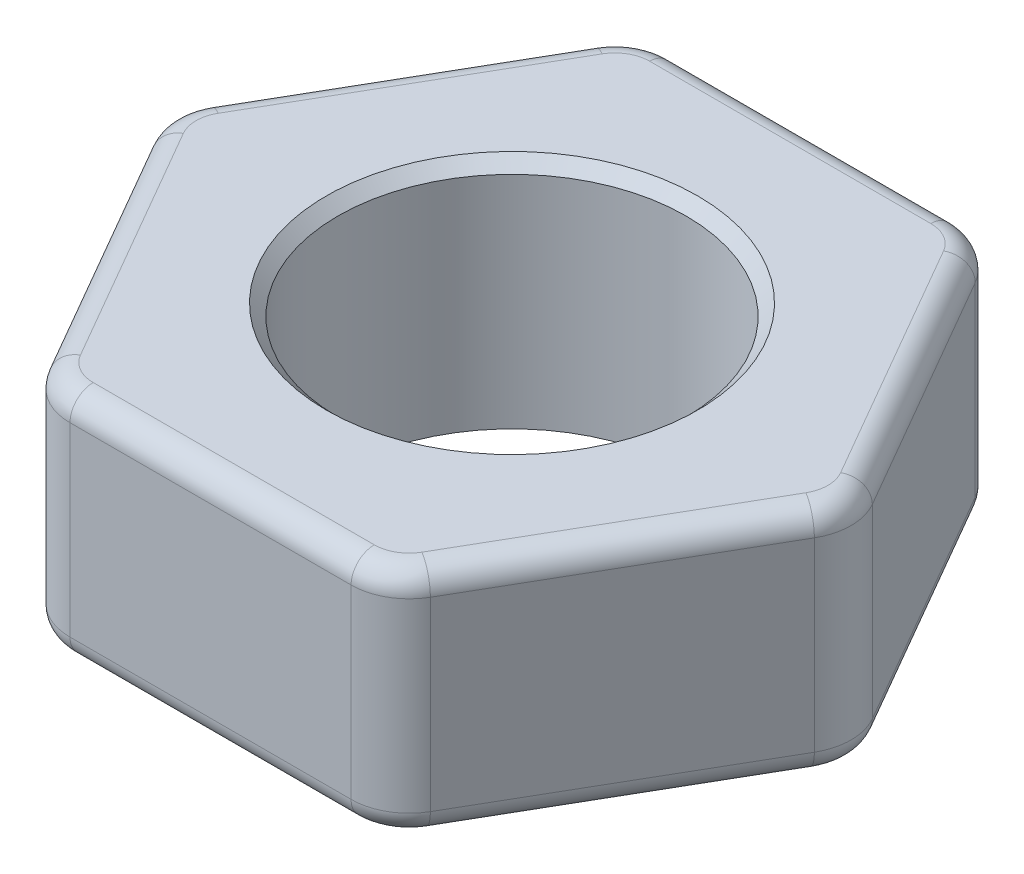
ISO-10303-21;
HEADER;
FILE_DESCRIPTION(('STEP AP214'),'2;1');
FILE_NAME('part.step','',(''),(''),'','','');
FILE_SCHEMA(('AUTOMOTIVE_DESIGN { 1 0 10303 214 1 1 1 1 }'));
ENDSEC;
DATA;
#1=APPLICATION_CONTEXT('core data for automotive mechanical design processes');
#2=APPLICATION_PROTOCOL_DEFINITION('international standard','automotive_design',2000,#1);
#3=PRODUCT_CONTEXT('',#1,'mechanical');
#4=PRODUCT('Part','Part','',(#3));
#5=PRODUCT_RELATED_PRODUCT_CATEGORY('part','',(#4));
#6=PRODUCT_DEFINITION_FORMATION('','',#4);
#7=PRODUCT_DEFINITION_CONTEXT('part definition',#1,'design');
#8=PRODUCT_DEFINITION('design','',#6,#7);
#9=PRODUCT_DEFINITION_SHAPE('','',#8);
#10=(LENGTH_UNIT() NAMED_UNIT(*) SI_UNIT(.MILLI.,.METRE.));
#11=(NAMED_UNIT(*) PLANE_ANGLE_UNIT() SI_UNIT($,.RADIAN.));
#12=(NAMED_UNIT(*) SI_UNIT($,.STERADIAN.) SOLID_ANGLE_UNIT());
#13=UNCERTAINTY_MEASURE_WITH_UNIT(LENGTH_MEASURE(1.E-05),#10,'distance_accuracy_value','');
#14=(GEOMETRIC_REPRESENTATION_CONTEXT(3) GLOBAL_UNCERTAINTY_ASSIGNED_CONTEXT((#13)) GLOBAL_UNIT_ASSIGNED_CONTEXT((#10,
#11,#12)) REPRESENTATION_CONTEXT('',''));
#15=CARTESIAN_POINT('',(0.,0.,0.));
#16=DIRECTION('',(0.,0.,1.));
#17=DIRECTION('',(1.,0.,0.));
#18=AXIS2_PLACEMENT_3D('',#15,#16,#17);
#19=CARTESIAN_POINT('',(1.5,2.,2.59807621135332));
#20=DIRECTION('',(-0.866025403784439,0.,-0.5));
#21=DIRECTION('',(-0.5,0.,0.866025403784439));
#22=AXIS2_PLACEMENT_3D('',#19,#20,#21);
#23=PLANE('',#22);
#24=DIRECTION('',(0.,-1.,0.));
#25=VECTOR('',#24,1.);
#26=CARTESIAN_POINT('',(1.64433756729741,2.,2.34807621135332));
#27=LINE('',#26,#25);
#28=CARTESIAN_POINT('',(1.64433756729741,1.8,2.34807621135332));
#29=VERTEX_POINT('',#28);
#30=CARTESIAN_POINT('',(1.64433756729741,0.2,2.34807621135332));
#31=VERTEX_POINT('',#30);
#32=EDGE_CURVE('E230',#29,#31,#27,.T.);
#33=ORIENTED_EDGE('',*,*,#32,.T.);
#34=DIRECTION('',(0.5,0.,-0.866025403784439));
#35=VECTOR('',#34,1.);
#36=CARTESIAN_POINT('',(1.5,0.2,2.59807621135332));
#37=LINE('',#36,#35);
#38=CARTESIAN_POINT('',(2.85566243270259,0.2,0.249999999999999));
#39=VERTEX_POINT('',#38);
#40=EDGE_CURVE('E285',#31,#39,#37,.T.);
#41=ORIENTED_EDGE('',*,*,#40,.T.);
#42=DIRECTION('',(0.,-1.,0.));
#43=VECTOR('',#42,1.);
#44=CARTESIAN_POINT('',(2.85566243270259,2.,0.249999999999999));
#45=LINE('',#44,#43);
#46=CARTESIAN_POINT('',(2.85566243270259,1.8,0.249999999999999));
#47=VERTEX_POINT('',#46);
#48=EDGE_CURVE('E227',#39,#47,#45,.F.);
#49=ORIENTED_EDGE('',*,*,#48,.T.);
#50=DIRECTION('',(0.5,0.,-0.866025403784439));
#51=VECTOR('',#50,1.);
#52=CARTESIAN_POINT('',(1.64433756729741,1.8,2.34807621135331));
#53=LINE('',#52,#51);
#54=EDGE_CURVE('E283',#47,#29,#53,.F.);
#55=ORIENTED_EDGE('',*,*,#54,.T.);
#56=EDGE_LOOP('',(#33,#41,#49,#55));
#57=FACE_BOUND('',#56,.T.);
#58=ADVANCED_FACE('F39',(#57),#23,.F.);
#59=CARTESIAN_POINT('',(3.,2.,0.));
#60=DIRECTION('',(-0.866025403784439,0.,0.5));
#61=DIRECTION('',(0.5,0.,0.866025403784439));
#62=AXIS2_PLACEMENT_3D('',#59,#60,#61);
#63=PLANE('',#62);
#64=DIRECTION('',(0.,-1.,0.));
#65=VECTOR('',#64,1.);
#66=CARTESIAN_POINT('',(2.85566243270259,2.,-0.25));
#67=LINE('',#66,#65);
#68=CARTESIAN_POINT('',(2.85566243270259,1.8,-0.25));
#69=VERTEX_POINT('',#68);
#70=CARTESIAN_POINT('',(2.85566243270259,0.2,-0.25));
#71=VERTEX_POINT('',#70);
#72=EDGE_CURVE('E565',#69,#71,#67,.T.);
#73=ORIENTED_EDGE('',*,*,#72,.T.);
#74=DIRECTION('',(-0.5,0.,-0.866025403784439));
#75=VECTOR('',#74,1.);
#76=CARTESIAN_POINT('',(3.,0.2,0.));
#77=LINE('',#76,#75);
#78=CARTESIAN_POINT('',(1.6443375672974,0.2,-2.34807621135332));
#79=VERTEX_POINT('',#78);
#80=EDGE_CURVE('E277',#71,#79,#77,.T.);
#81=ORIENTED_EDGE('',*,*,#80,.T.);
#82=DIRECTION('',(0.,-1.,0.));
#83=VECTOR('',#82,1.);
#84=CARTESIAN_POINT('',(1.6443375672974,2.,-2.34807621135332));
#85=LINE('',#84,#83);
#86=CARTESIAN_POINT('',(1.6443375672974,1.8,-2.34807621135332));
#87=VERTEX_POINT('',#86);
#88=EDGE_CURVE('E568',#79,#87,#85,.F.);
#89=ORIENTED_EDGE('',*,*,#88,.T.);
#90=DIRECTION('',(-0.5,0.,-0.866025403784439));
#91=VECTOR('',#90,1.);
#92=CARTESIAN_POINT('',(2.85566243270259,1.8,-0.25));
#93=LINE('',#92,#91);
#94=EDGE_CURVE('E275',#87,#69,#93,.F.);
#95=ORIENTED_EDGE('',*,*,#94,.T.);
#96=EDGE_LOOP('',(#73,#81,#89,#95));
#97=FACE_BOUND('',#96,.T.);
#98=ADVANCED_FACE('F402',(#97),#63,.F.);
#99=CARTESIAN_POINT('',(1.5,2.,-2.59807621135332));
#100=DIRECTION('',(0.,0.,1.));
#101=DIRECTION('',(1.,0.,0.));
#102=AXIS2_PLACEMENT_3D('',#99,#100,#101);
#103=PLANE('',#102);
#104=DIRECTION('',(0.,-1.,0.));
#105=VECTOR('',#104,1.);
#106=CARTESIAN_POINT('',(1.21132486540519,2.,-2.59807621135332));
#107=LINE('',#106,#105);
#108=CARTESIAN_POINT('',(1.21132486540519,1.8,-2.59807621135332));
#109=VERTEX_POINT('',#108);
#110=CARTESIAN_POINT('',(1.21132486540519,0.2,-2.59807621135332));
#111=VERTEX_POINT('',#110);
#112=EDGE_CURVE('E559',#109,#111,#107,.T.);
#113=ORIENTED_EDGE('',*,*,#112,.T.);
#114=DIRECTION('',(-1.,0.,0.));
#115=VECTOR('',#114,1.);
#116=CARTESIAN_POINT('',(1.5,0.2,-2.59807621135332));
#117=LINE('',#116,#115);
#118=CARTESIAN_POINT('',(-1.21132486540519,0.2,-2.59807621135332));
#119=VERTEX_POINT('',#118);
#120=EDGE_CURVE('E269',#111,#119,#117,.T.);
#121=ORIENTED_EDGE('',*,*,#120,.T.);
#122=DIRECTION('',(0.,-1.,0.));
#123=VECTOR('',#122,1.);
#124=CARTESIAN_POINT('',(-1.21132486540519,2.,-2.59807621135332));
#125=LINE('',#124,#123);
#126=CARTESIAN_POINT('',(-1.21132486540519,1.8,-2.59807621135332));
#127=VERTEX_POINT('',#126);
#128=EDGE_CURVE('E562',#119,#127,#125,.F.);
#129=ORIENTED_EDGE('',*,*,#128,.T.);
#130=DIRECTION('',(-1.,0.,0.));
#131=VECTOR('',#130,1.);
#132=CARTESIAN_POINT('',(1.21132486540519,1.8,-2.59807621135332));
#133=LINE('',#132,#131);
#134=EDGE_CURVE('E267',#127,#109,#133,.F.);
#135=ORIENTED_EDGE('',*,*,#134,.T.);
#136=EDGE_LOOP('',(#113,#121,#129,#135));
#137=FACE_BOUND('',#136,.T.);
#138=ADVANCED_FACE('F408',(#137),#103,.F.);
#139=CARTESIAN_POINT('',(-1.5,2.,-2.59807621135332));
#140=DIRECTION('',(0.866025403784439,0.,0.5));
#141=DIRECTION('',(0.5,0.,-0.866025403784439));
#142=AXIS2_PLACEMENT_3D('',#139,#140,#141);
#143=PLANE('',#142);
#144=DIRECTION('',(0.,-1.,0.));
#145=VECTOR('',#144,1.);
#146=CARTESIAN_POINT('',(-1.64433756729741,2.,-2.34807621135332));
#147=LINE('',#146,#145);
#148=CARTESIAN_POINT('',(-1.64433756729741,1.8,-2.34807621135332));
#149=VERTEX_POINT('',#148);
#150=CARTESIAN_POINT('',(-1.64433756729741,0.2,-2.34807621135332));
#151=VERTEX_POINT('',#150);
#152=EDGE_CURVE('E553',#149,#151,#147,.T.);
#153=ORIENTED_EDGE('',*,*,#152,.T.);
#154=DIRECTION('',(-0.5,0.,0.866025403784439));
#155=VECTOR('',#154,1.);
#156=CARTESIAN_POINT('',(-1.5,0.2,-2.59807621135332));
#157=LINE('',#156,#155);
#158=CARTESIAN_POINT('',(-2.85566243270259,0.2,-0.25));
#159=VERTEX_POINT('',#158);
#160=EDGE_CURVE('E260',#151,#159,#157,.T.);
#161=ORIENTED_EDGE('',*,*,#160,.T.);
#162=DIRECTION('',(0.,-1.,0.));
#163=VECTOR('',#162,1.);
#164=CARTESIAN_POINT('',(-2.85566243270259,2.,-0.25));
#165=LINE('',#164,#163);
#166=CARTESIAN_POINT('',(-2.85566243270259,1.8,-0.25));
#167=VERTEX_POINT('',#166);
#168=EDGE_CURVE('E556',#159,#167,#165,.F.);
#169=ORIENTED_EDGE('',*,*,#168,.T.);
#170=DIRECTION('',(-0.5,0.,0.866025403784439));
#171=VECTOR('',#170,1.);
#172=CARTESIAN_POINT('',(-1.64433756729741,1.8,-2.34807621135332));
#173=LINE('',#172,#171);
#174=EDGE_CURVE('E258',#167,#149,#173,.F.);
#175=ORIENTED_EDGE('',*,*,#174,.T.);
#176=EDGE_LOOP('',(#153,#161,#169,#175));
#177=FACE_BOUND('',#176,.T.);
#178=ADVANCED_FACE('F607',(#177),#143,.F.);
#179=CARTESIAN_POINT('',(-3.,2.,0.));
#180=DIRECTION('',(0.866025403784439,0.,-0.5));
#181=DIRECTION('',(-0.5,0.,-0.866025403784439));
#182=AXIS2_PLACEMENT_3D('',#179,#180,#181);
#183=PLANE('',#182);
#184=DIRECTION('',(0.,-1.,0.));
#185=VECTOR('',#184,1.);
#186=CARTESIAN_POINT('',(-1.64433756729741,2.,2.34807621135331));
#187=LINE('',#186,#185);
#188=CARTESIAN_POINT('',(-1.64433756729741,0.2,2.34807621135331));
#189=VERTEX_POINT('',#188);
#190=CARTESIAN_POINT('',(-1.64433756729741,1.8,2.34807621135331));
#191=VERTEX_POINT('',#190);
#192=EDGE_CURVE('E547',#189,#191,#187,.F.);
#193=ORIENTED_EDGE('',*,*,#192,.T.);
#194=DIRECTION('',(0.5,0.,0.866025403784439));
#195=VECTOR('',#194,1.);
#196=CARTESIAN_POINT('',(-2.85566243270259,1.8,0.249999999999999));
#197=LINE('',#196,#195);
#198=CARTESIAN_POINT('',(-2.85566243270259,1.8,0.249999999999999));
#199=VERTEX_POINT('',#198);
#200=EDGE_CURVE('E322',#191,#199,#197,.F.);
#201=ORIENTED_EDGE('',*,*,#200,.T.);
#202=DIRECTION('',(0.,-1.,0.));
#203=VECTOR('',#202,1.);
#204=CARTESIAN_POINT('',(-2.85566243270259,2.,0.249999999999999));
#205=LINE('',#204,#203);
#206=CARTESIAN_POINT('',(-2.85566243270259,0.2,0.249999999999999));
#207=VERTEX_POINT('',#206);
#208=EDGE_CURVE('E544',#199,#207,#205,.T.);
#209=ORIENTED_EDGE('',*,*,#208,.T.);
#210=DIRECTION('',(0.5,0.,0.866025403784439));
#211=VECTOR('',#210,1.);
#212=CARTESIAN_POINT('',(-3.,0.2,0.));
#213=LINE('',#212,#211);
#214=EDGE_CURVE('E320',#207,#189,#213,.T.);
#215=ORIENTED_EDGE('',*,*,#214,.T.);
#216=EDGE_LOOP('',(#193,#201,#209,#215));
#217=FACE_BOUND('',#216,.T.);
#218=ADVANCED_FACE('F620',(#217),#183,.F.);
#219=CARTESIAN_POINT('',(-1.5,2.,2.59807621135331));
#220=DIRECTION('',(0.,0.,-1.));
#221=DIRECTION('',(-1.,0.,0.));
#222=AXIS2_PLACEMENT_3D('',#219,#220,#221);
#223=PLANE('',#222);
#224=DIRECTION('',(0.,-1.,0.));
#225=VECTOR('',#224,1.);
#226=CARTESIAN_POINT('',(-1.21132486540519,2.,2.59807621135331));
#227=LINE('',#226,#225);
#228=CARTESIAN_POINT('',(-1.21132486540519,1.8,2.59807621135331));
#229=VERTEX_POINT('',#228);
#230=CARTESIAN_POINT('',(-1.21132486540519,0.2,2.59807621135331));
#231=VERTEX_POINT('',#230);
#232=EDGE_CURVE('E538',#229,#231,#227,.T.);
#233=ORIENTED_EDGE('',*,*,#232,.T.);
#234=DIRECTION('',(1.,0.,0.));
#235=VECTOR('',#234,1.);
#236=CARTESIAN_POINT('',(-1.5,0.2,2.59807621135331));
#237=LINE('',#236,#235);
#238=CARTESIAN_POINT('',(1.21132486540519,0.2,2.59807621135332));
#239=VERTEX_POINT('',#238);
#240=EDGE_CURVE('E293',#231,#239,#237,.T.);
#241=ORIENTED_EDGE('',*,*,#240,.T.);
#242=DIRECTION('',(0.,-1.,0.));
#243=VECTOR('',#242,1.);
#244=CARTESIAN_POINT('',(1.21132486540519,2.,2.59807621135332));
#245=LINE('',#244,#243);
#246=CARTESIAN_POINT('',(1.21132486540519,1.8,2.59807621135332));
#247=VERTEX_POINT('',#246);
#248=EDGE_CURVE('E541',#239,#247,#245,.F.);
#249=ORIENTED_EDGE('',*,*,#248,.T.);
#250=DIRECTION('',(1.,0.,0.));
#251=VECTOR('',#250,1.);
#252=CARTESIAN_POINT('',(-1.21132486540519,1.8,2.59807621135331));
#253=LINE('',#252,#251);
#254=EDGE_CURVE('E291',#247,#229,#253,.F.);
#255=ORIENTED_EDGE('',*,*,#254,.T.);
#256=EDGE_LOOP('',(#233,#241,#249,#255));
#257=FACE_BOUND('',#256,.T.);
#258=ADVANCED_FACE('F537',(#257),#223,.F.);
#259=CARTESIAN_POINT('',(0.,2.,0.));
#260=DIRECTION('',(0.,1.,0.));
#261=DIRECTION('',(0.,0.,1.));
#262=AXIS2_PLACEMENT_3D('',#259,#260,#261);
#263=PLANE('',#262);
#264=CARTESIAN_POINT('',(0.,2.,0.));
#265=DIRECTION('',(0.,1.,0.));
#266=DIRECTION('',(0.,0.,1.));
#267=AXIS2_PLACEMENT_3D('',#264,#265,#266);
#268=CIRCLE('',#267,1.6);
#269=CARTESIAN_POINT('',(0.,2.,1.6));
#270=VERTEX_POINT('',#269);
#271=EDGE_CURVE('E11',#270,#270,#268,.F.);
#272=ORIENTED_EDGE('',*,*,#271,.T.);
#273=EDGE_LOOP('',(#272));
#274=FACE_BOUND('',#273,.T.);
#275=DIRECTION('',(-1.,0.,0.));
#276=VECTOR('',#275,1.);
#277=CARTESIAN_POINT('',(-1.21132486540519,2.,-2.39807621135332));
#278=LINE('',#277,#276);
#279=CARTESIAN_POINT('',(1.21132486540519,2.,-2.39807621135332));
#280=VERTEX_POINT('',#279);
#281=CARTESIAN_POINT('',(-1.21132486540519,2.,-2.39807621135332));
#282=VERTEX_POINT('',#281);
#283=EDGE_CURVE('E55',#280,#282,#278,.T.);
#284=ORIENTED_EDGE('',*,*,#283,.T.);
#285=CARTESIAN_POINT('',(-1.21132486540519,2.,-2.09807621135332));
#286=DIRECTION('',(0.,1.,0.));
#287=DIRECTION('',(0.,0.,1.));
#288=AXIS2_PLACEMENT_3D('',#285,#286,#287);
#289=CIRCLE('',#288,0.3);
#290=CARTESIAN_POINT('',(-1.47113248654052,2.,-2.24807621135332));
#291=VERTEX_POINT('',#290);
#292=EDGE_CURVE('E318',#282,#291,#289,.T.);
#293=ORIENTED_EDGE('',*,*,#292,.T.);
#294=DIRECTION('',(-0.5,0.,0.866025403784439));
#295=VECTOR('',#294,1.);
#296=CARTESIAN_POINT('',(-2.68245735194571,2.,-0.15));
#297=LINE('',#296,#295);
#298=CARTESIAN_POINT('',(-2.68245735194571,2.,-0.15));
#299=VERTEX_POINT('',#298);
#300=EDGE_CURVE('E298',#291,#299,#297,.T.);
#301=ORIENTED_EDGE('',*,*,#300,.T.);
#302=CARTESIAN_POINT('',(-2.42264973081037,2.,0.));
#303=DIRECTION('',(0.,1.,0.));
#304=DIRECTION('',(0.,0.,1.));
#305=AXIS2_PLACEMENT_3D('',#302,#303,#304);
#306=CIRCLE('',#305,0.3);
#307=CARTESIAN_POINT('',(-2.68245735194571,2.,0.149999999999999));
#308=VERTEX_POINT('',#307);
#309=EDGE_CURVE('E300',#299,#308,#306,.T.);
#310=ORIENTED_EDGE('',*,*,#309,.T.);
#311=DIRECTION('',(0.5,0.,0.866025403784439));
#312=VECTOR('',#311,1.);
#313=CARTESIAN_POINT('',(-1.47113248654052,2.,2.24807621135332));
#314=LINE('',#313,#312);
#315=CARTESIAN_POINT('',(-1.47113248654052,2.,2.24807621135331));
#316=VERTEX_POINT('',#315);
#317=EDGE_CURVE('E302',#308,#316,#314,.T.);
#318=ORIENTED_EDGE('',*,*,#317,.T.);
#319=CARTESIAN_POINT('',(-1.21132486540519,2.,2.09807621135331));
#320=DIRECTION('',(0.,1.,0.));
#321=DIRECTION('',(0.,0.,1.));
#322=AXIS2_PLACEMENT_3D('',#319,#320,#321);
#323=CIRCLE('',#322,0.3);
#324=CARTESIAN_POINT('',(-1.21132486540519,2.,2.39807621135331));
#325=VERTEX_POINT('',#324);
#326=EDGE_CURVE('E304',#316,#325,#323,.T.);
#327=ORIENTED_EDGE('',*,*,#326,.T.);
#328=DIRECTION('',(1.,0.,0.));
#329=VECTOR('',#328,1.);
#330=CARTESIAN_POINT('',(1.21132486540519,2.,2.39807621135332));
#331=LINE('',#330,#329);
#332=CARTESIAN_POINT('',(1.21132486540519,2.,2.39807621135332));
#333=VERTEX_POINT('',#332);
#334=EDGE_CURVE('E306',#325,#333,#331,.T.);
#335=ORIENTED_EDGE('',*,*,#334,.T.);
#336=CARTESIAN_POINT('',(1.21132486540519,2.,2.09807621135332));
#337=DIRECTION('',(0.,1.,0.));
#338=DIRECTION('',(0.,0.,1.));
#339=AXIS2_PLACEMENT_3D('',#336,#337,#338);
#340=CIRCLE('',#339,0.3);
#341=CARTESIAN_POINT('',(1.47113248654052,2.,2.24807621135332));
#342=VERTEX_POINT('',#341);
#343=EDGE_CURVE('E308',#333,#342,#340,.T.);
#344=ORIENTED_EDGE('',*,*,#343,.T.);
#345=DIRECTION('',(0.5,0.,-0.866025403784439));
#346=VECTOR('',#345,1.);
#347=CARTESIAN_POINT('',(2.6824573519457,2.,0.149999999999999));
#348=LINE('',#347,#346);
#349=CARTESIAN_POINT('',(2.6824573519457,2.,0.149999999999999));
#350=VERTEX_POINT('',#349);
#351=EDGE_CURVE('E310',#342,#350,#348,.T.);
#352=ORIENTED_EDGE('',*,*,#351,.T.);
#353=CARTESIAN_POINT('',(2.42264973081037,2.,0.));
#354=DIRECTION('',(0.,1.,0.));
#355=DIRECTION('',(0.,0.,1.));
#356=AXIS2_PLACEMENT_3D('',#353,#354,#355);
#357=CIRCLE('',#356,0.3);
#358=CARTESIAN_POINT('',(2.6824573519457,2.,-0.15));
#359=VERTEX_POINT('',#358);
#360=EDGE_CURVE('E312',#350,#359,#357,.T.);
#361=ORIENTED_EDGE('',*,*,#360,.T.);
#362=DIRECTION('',(-0.5,0.,-0.866025403784439));
#363=VECTOR('',#362,1.);
#364=CARTESIAN_POINT('',(1.47113248654052,2.,-2.24807621135332));
#365=LINE('',#364,#363);
#366=CARTESIAN_POINT('',(1.47113248654052,2.,-2.24807621135332));
#367=VERTEX_POINT('',#366);
#368=EDGE_CURVE('E314',#359,#367,#365,.T.);
#369=ORIENTED_EDGE('',*,*,#368,.T.);
#370=CARTESIAN_POINT('',(1.21132486540519,2.,-2.09807621135332));
#371=DIRECTION('',(0.,1.,0.));
#372=DIRECTION('',(0.,0.,1.));
#373=AXIS2_PLACEMENT_3D('',#370,#371,#372);
#374=CIRCLE('',#373,0.3);
#375=EDGE_CURVE('E60',#367,#280,#374,.T.);
#376=ORIENTED_EDGE('',*,*,#375,.T.);
#377=EDGE_LOOP('',(#284,#293,#301,#310,#318,#327,#335,#344,#352,#361,#369,#376));
#378=FACE_BOUND('',#377,.T.);
#379=ADVANCED_FACE('F598',(#274,#378),#263,.T.);
#380=CARTESIAN_POINT('',(0.,0.,0.));
#381=DIRECTION('',(0.,1.,0.));
#382=DIRECTION('',(0.,0.,1.));
#383=AXIS2_PLACEMENT_3D('',#380,#381,#382);
#384=PLANE('',#383);
#385=DIRECTION('',(0.5,0.,0.866025403784439));
#386=VECTOR('',#385,1.);
#387=CARTESIAN_POINT('',(-2.07679491924311,0.,1.19903810567666));
#388=LINE('',#387,#386);
#389=CARTESIAN_POINT('',(-1.47113248654052,0.,2.24807621135331));
#390=VERTEX_POINT('',#389);
#391=CARTESIAN_POINT('',(-2.68245735194571,0.,0.149999999999999));
#392=VERTEX_POINT('',#391);
#393=EDGE_CURVE('E206',#390,#392,#388,.F.);
#394=ORIENTED_EDGE('',*,*,#393,.T.);
#395=CARTESIAN_POINT('',(-2.42264973081037,0.,0.));
#396=DIRECTION('',(0.,1.,0.));
#397=DIRECTION('',(0.,0.,1.));
#398=AXIS2_PLACEMENT_3D('',#395,#396,#397);
#399=CIRCLE('',#398,0.3);
#400=CARTESIAN_POINT('',(-2.68245735194571,0.,-0.15));
#401=VERTEX_POINT('',#400);
#402=EDGE_CURVE('E251',#392,#401,#399,.F.);
#403=ORIENTED_EDGE('',*,*,#402,.T.);
#404=DIRECTION('',(-0.5,0.,0.866025403784439));
#405=VECTOR('',#404,1.);
#406=CARTESIAN_POINT('',(-2.07679491924311,0.,-1.19903810567666));
#407=LINE('',#406,#405);
#408=CARTESIAN_POINT('',(-1.47113248654052,0.,-2.24807621135332));
#409=VERTEX_POINT('',#408);
#410=EDGE_CURVE('E249',#401,#409,#407,.F.);
#411=ORIENTED_EDGE('',*,*,#410,.T.);
#412=CARTESIAN_POINT('',(-1.21132486540519,0.,-2.09807621135332));
#413=DIRECTION('',(0.,1.,0.));
#414=DIRECTION('',(0.,0.,1.));
#415=AXIS2_PLACEMENT_3D('',#412,#413,#414);
#416=CIRCLE('',#415,0.3);
#417=CARTESIAN_POINT('',(-1.21132486540519,0.,-2.39807621135332));
#418=VERTEX_POINT('',#417);
#419=EDGE_CURVE('E247',#409,#418,#416,.F.);
#420=ORIENTED_EDGE('',*,*,#419,.T.);
#421=DIRECTION('',(-1.,0.,0.));
#422=VECTOR('',#421,1.);
#423=CARTESIAN_POINT('',(0.,0.,-2.39807621135332));
#424=LINE('',#423,#422);
#425=CARTESIAN_POINT('',(1.21132486540519,0.,-2.39807621135332));
#426=VERTEX_POINT('',#425);
#427=EDGE_CURVE('E245',#418,#426,#424,.F.);
#428=ORIENTED_EDGE('',*,*,#427,.T.);
#429=CARTESIAN_POINT('',(1.21132486540519,0.,-2.09807621135332));
#430=DIRECTION('',(0.,1.,0.));
#431=DIRECTION('',(0.,0.,1.));
#432=AXIS2_PLACEMENT_3D('',#429,#430,#431);
#433=CIRCLE('',#432,0.3);
#434=CARTESIAN_POINT('',(1.47113248654052,0.,-2.24807621135332));
#435=VERTEX_POINT('',#434);
#436=EDGE_CURVE('E243',#426,#435,#433,.F.);
#437=ORIENTED_EDGE('',*,*,#436,.T.);
#438=DIRECTION('',(-0.5,0.,-0.866025403784439));
#439=VECTOR('',#438,1.);
#440=CARTESIAN_POINT('',(2.07679491924311,0.,-1.19903810567666));
#441=LINE('',#440,#439);
#442=CARTESIAN_POINT('',(2.6824573519457,0.,-0.15));
#443=VERTEX_POINT('',#442);
#444=EDGE_CURVE('E241',#435,#443,#441,.F.);
#445=ORIENTED_EDGE('',*,*,#444,.T.);
#446=CARTESIAN_POINT('',(2.42264973081037,0.,0.));
#447=DIRECTION('',(0.,1.,0.));
#448=DIRECTION('',(0.,0.,1.));
#449=AXIS2_PLACEMENT_3D('',#446,#447,#448);
#450=CIRCLE('',#449,0.3);
#451=CARTESIAN_POINT('',(2.6824573519457,0.,0.149999999999999));
#452=VERTEX_POINT('',#451);
#453=EDGE_CURVE('E239',#443,#452,#450,.F.);
#454=ORIENTED_EDGE('',*,*,#453,.T.);
#455=DIRECTION('',(0.5,0.,-0.866025403784439));
#456=VECTOR('',#455,1.);
#457=CARTESIAN_POINT('',(2.07679491924311,0.,1.19903810567666));
#458=LINE('',#457,#456);
#459=CARTESIAN_POINT('',(1.47113248654052,0.,2.24807621135332));
#460=VERTEX_POINT('',#459);
#461=EDGE_CURVE('E237',#452,#460,#458,.F.);
#462=ORIENTED_EDGE('',*,*,#461,.T.);
#463=CARTESIAN_POINT('',(1.21132486540519,0.,2.09807621135332));
#464=DIRECTION('',(0.,1.,0.));
#465=DIRECTION('',(0.,0.,1.));
#466=AXIS2_PLACEMENT_3D('',#463,#464,#465);
#467=CIRCLE('',#466,0.3);
#468=CARTESIAN_POINT('',(1.21132486540519,0.,2.39807621135332));
#469=VERTEX_POINT('',#468);
#470=EDGE_CURVE('E235',#460,#469,#467,.F.);
#471=ORIENTED_EDGE('',*,*,#470,.T.);
#472=DIRECTION('',(1.,0.,0.));
#473=VECTOR('',#472,1.);
#474=CARTESIAN_POINT('',(0.,0.,2.39807621135331));
#475=LINE('',#474,#473);
#476=CARTESIAN_POINT('',(-1.21132486540519,0.,2.39807621135331));
#477=VERTEX_POINT('',#476);
#478=EDGE_CURVE('E209',#469,#477,#475,.F.);
#479=ORIENTED_EDGE('',*,*,#478,.T.);
#480=CARTESIAN_POINT('',(-1.21132486540519,0.,2.09807621135331));
#481=DIRECTION('',(0.,1.,0.));
#482=DIRECTION('',(0.,0.,1.));
#483=AXIS2_PLACEMENT_3D('',#480,#481,#482);
#484=CIRCLE('',#483,0.3);
#485=EDGE_CURVE('E200',#477,#390,#484,.F.);
#486=ORIENTED_EDGE('',*,*,#485,.T.);
#487=EDGE_LOOP('',(#394,#403,#411,#420,#428,#437,#445,#454,#462,#471,#479,#486));
#488=FACE_BOUND('',#487,.T.);
#489=CARTESIAN_POINT('',(0.,0.,0.));
#490=DIRECTION('',(0.,1.,0.));
#491=DIRECTION('',(0.,0.,1.));
#492=AXIS2_PLACEMENT_3D('',#489,#490,#491);
#493=CIRCLE('',#492,1.5);
#494=CARTESIAN_POINT('',(0.,0.,1.5));
#495=VERTEX_POINT('',#494);
#496=EDGE_CURVE('E352',#495,#495,#493,.T.);
#497=ORIENTED_EDGE('',*,*,#496,.T.);
#498=EDGE_LOOP('',(#497));
#499=FACE_BOUND('',#498,.T.);
#500=ADVANCED_FACE('F202',(#488,#499),#384,.F.);
#501=CARTESIAN_POINT('',(0.,0.,0.));
#502=DIRECTION('',(0.,1.,0.));
#503=DIRECTION('',(0.,0.,1.));
#504=AXIS2_PLACEMENT_3D('',#501,#502,#503);
#505=CYLINDRICAL_SURFACE('',#504,1.5);
#506=CARTESIAN_POINT('',(0.,1.9,0.));
#507=DIRECTION('',(0.,1.,0.));
#508=DIRECTION('',(0.,0.,1.));
#509=AXIS2_PLACEMENT_3D('',#506,#507,#508);
#510=CIRCLE('',#509,1.5);
#511=CARTESIAN_POINT('',(0.,1.9,1.5));
#512=VERTEX_POINT('',#511);
#513=EDGE_CURVE('E48',#512,#512,#510,.T.);
#514=ORIENTED_EDGE('',*,*,#513,.T.);
#515=EDGE_LOOP('',(#514));
#516=FACE_BOUND('',#515,.T.);
#517=ORIENTED_EDGE('',*,*,#496,.F.);
#518=EDGE_LOOP('',(#517));
#519=FACE_BOUND('',#518,.T.);
#520=ADVANCED_FACE('F388',(#516,#519),#505,.F.);
#521=CARTESIAN_POINT('',(-1.21132486540519,2.,2.09807621135331));
#522=DIRECTION('',(0.,-1.,0.));
#523=DIRECTION('',(0.,0.,-1.));
#524=AXIS2_PLACEMENT_3D('',#521,#522,#523);
#525=CYLINDRICAL_SURFACE('',#524,0.5);
#526=ORIENTED_EDGE('',*,*,#192,.F.);
#527=CARTESIAN_POINT('',(-1.21132486540519,0.2,2.09807621135331));
#528=DIRECTION('',(0.,1.,0.));
#529=DIRECTION('',(0.,0.,1.));
#530=AXIS2_PLACEMENT_3D('',#527,#528,#529);
#531=CIRCLE('',#530,0.5);
#532=EDGE_CURVE('E218',#189,#231,#531,.T.);
#533=ORIENTED_EDGE('',*,*,#532,.T.);
#534=ORIENTED_EDGE('',*,*,#232,.F.);
#535=CARTESIAN_POINT('',(-1.21132486540519,1.8,2.09807621135331));
#536=DIRECTION('',(0.,1.,0.));
#537=DIRECTION('',(0.,0.,1.));
#538=AXIS2_PLACEMENT_3D('',#535,#536,#537);
#539=CIRCLE('',#538,0.5);
#540=EDGE_CURVE('E295',#229,#191,#539,.F.);
#541=ORIENTED_EDGE('',*,*,#540,.T.);
#542=EDGE_LOOP('',(#526,#533,#534,#541));
#543=FACE_BOUND('',#542,.T.);
#544=ADVANCED_FACE('F414',(#543),#525,.T.);
#545=CARTESIAN_POINT('',(-2.42264973081037,2.,0.));
#546=DIRECTION('',(0.,-1.,0.));
#547=DIRECTION('',(0.,0.,-1.));
#548=AXIS2_PLACEMENT_3D('',#545,#546,#547);
#549=CYLINDRICAL_SURFACE('',#548,0.5);
#550=ORIENTED_EDGE('',*,*,#168,.F.);
#551=CARTESIAN_POINT('',(-2.42264973081037,0.2,0.));
#552=DIRECTION('',(0.,1.,0.));
#553=DIRECTION('',(0.,0.,1.));
#554=AXIS2_PLACEMENT_3D('',#551,#552,#553);
#555=CIRCLE('',#554,0.5);
#556=EDGE_CURVE('E255',#159,#207,#555,.T.);
#557=ORIENTED_EDGE('',*,*,#556,.T.);
#558=ORIENTED_EDGE('',*,*,#208,.F.);
#559=CARTESIAN_POINT('',(-2.42264973081037,1.8,0.));
#560=DIRECTION('',(0.,1.,0.));
#561=DIRECTION('',(0.,0.,1.));
#562=AXIS2_PLACEMENT_3D('',#559,#560,#561);
#563=CIRCLE('',#562,0.5);
#564=EDGE_CURVE('E253',#199,#167,#563,.F.);
#565=ORIENTED_EDGE('',*,*,#564,.T.);
#566=EDGE_LOOP('',(#550,#557,#558,#565));
#567=FACE_BOUND('',#566,.T.);
#568=ADVANCED_FACE('F417',(#567),#549,.T.);
#569=CARTESIAN_POINT('',(-1.21132486540519,2.,-2.09807621135332));
#570=DIRECTION('',(0.,-1.,0.));
#571=DIRECTION('',(0.,0.,-1.));
#572=AXIS2_PLACEMENT_3D('',#569,#570,#571);
#573=CYLINDRICAL_SURFACE('',#572,0.5);
#574=ORIENTED_EDGE('',*,*,#128,.F.);
#575=CARTESIAN_POINT('',(-1.21132486540519,0.2,-2.09807621135332));
#576=DIRECTION('',(0.,1.,0.));
#577=DIRECTION('',(0.,0.,1.));
#578=AXIS2_PLACEMENT_3D('',#575,#576,#577);
#579=CIRCLE('',#578,0.5);
#580=EDGE_CURVE('E265',#119,#151,#579,.T.);
#581=ORIENTED_EDGE('',*,*,#580,.T.);
#582=ORIENTED_EDGE('',*,*,#152,.F.);
#583=CARTESIAN_POINT('',(-1.21132486540519,1.8,-2.09807621135332));
#584=DIRECTION('',(0.,1.,0.));
#585=DIRECTION('',(0.,0.,1.));
#586=AXIS2_PLACEMENT_3D('',#583,#584,#585);
#587=CIRCLE('',#586,0.5);
#588=EDGE_CURVE('E262',#149,#127,#587,.F.);
#589=ORIENTED_EDGE('',*,*,#588,.T.);
#590=EDGE_LOOP('',(#574,#581,#582,#589));
#591=FACE_BOUND('',#590,.T.);
#592=ADVANCED_FACE('F421',(#591),#573,.T.);
#593=CARTESIAN_POINT('',(1.21132486540519,2.,-2.09807621135332));
#594=DIRECTION('',(0.,-1.,0.));
#595=DIRECTION('',(0.,0.,-1.));
#596=AXIS2_PLACEMENT_3D('',#593,#594,#595);
#597=CYLINDRICAL_SURFACE('',#596,0.5);
#598=ORIENTED_EDGE('',*,*,#88,.F.);
#599=CARTESIAN_POINT('',(1.21132486540519,0.2,-2.09807621135332));
#600=DIRECTION('',(0.,1.,0.));
#601=DIRECTION('',(0.,0.,1.));
#602=AXIS2_PLACEMENT_3D('',#599,#600,#601);
#603=CIRCLE('',#602,0.5);
#604=EDGE_CURVE('E273',#79,#111,#603,.T.);
#605=ORIENTED_EDGE('',*,*,#604,.T.);
#606=ORIENTED_EDGE('',*,*,#112,.F.);
#607=CARTESIAN_POINT('',(1.21132486540519,1.8,-2.09807621135332));
#608=DIRECTION('',(0.,1.,0.));
#609=DIRECTION('',(0.,0.,1.));
#610=AXIS2_PLACEMENT_3D('',#607,#608,#609);
#611=CIRCLE('',#610,0.5);
#612=EDGE_CURVE('E271',#109,#87,#611,.F.);
#613=ORIENTED_EDGE('',*,*,#612,.T.);
#614=EDGE_LOOP('',(#598,#605,#606,#613));
#615=FACE_BOUND('',#614,.T.);
#616=ADVANCED_FACE('F425',(#615),#597,.T.);
#617=CARTESIAN_POINT('',(2.42264973081037,2.,0.));
#618=DIRECTION('',(0.,-1.,0.));
#619=DIRECTION('',(0.,0.,-1.));
#620=AXIS2_PLACEMENT_3D('',#617,#618,#619);
#621=CYLINDRICAL_SURFACE('',#620,0.5);
#622=ORIENTED_EDGE('',*,*,#48,.F.);
#623=CARTESIAN_POINT('',(2.42264973081037,0.2,0.));
#624=DIRECTION('',(0.,1.,0.));
#625=DIRECTION('',(0.,0.,1.));
#626=AXIS2_PLACEMENT_3D('',#623,#624,#625);
#627=CIRCLE('',#626,0.5);
#628=EDGE_CURVE('E281',#39,#71,#627,.T.);
#629=ORIENTED_EDGE('',*,*,#628,.T.);
#630=ORIENTED_EDGE('',*,*,#72,.F.);
#631=CARTESIAN_POINT('',(2.42264973081037,1.8,0.));
#632=DIRECTION('',(0.,1.,0.));
#633=DIRECTION('',(0.,0.,1.));
#634=AXIS2_PLACEMENT_3D('',#631,#632,#633);
#635=CIRCLE('',#634,0.5);
#636=EDGE_CURVE('E279',#69,#47,#635,.F.);
#637=ORIENTED_EDGE('',*,*,#636,.T.);
#638=EDGE_LOOP('',(#622,#629,#630,#637));
#639=FACE_BOUND('',#638,.T.);
#640=ADVANCED_FACE('F429',(#639),#621,.T.);
#641=CARTESIAN_POINT('',(1.21132486540519,2.,2.09807621135332));
#642=DIRECTION('',(0.,-1.,0.));
#643=DIRECTION('',(0.,0.,-1.));
#644=AXIS2_PLACEMENT_3D('',#641,#642,#643);
#645=CYLINDRICAL_SURFACE('',#644,0.5);
#646=ORIENTED_EDGE('',*,*,#248,.F.);
#647=CARTESIAN_POINT('',(1.21132486540519,0.2,2.09807621135332));
#648=DIRECTION('',(0.,1.,0.));
#649=DIRECTION('',(0.,0.,1.));
#650=AXIS2_PLACEMENT_3D('',#647,#648,#649);
#651=CIRCLE('',#650,0.5);
#652=EDGE_CURVE('E289',#239,#31,#651,.T.);
#653=ORIENTED_EDGE('',*,*,#652,.T.);
#654=ORIENTED_EDGE('',*,*,#32,.F.);
#655=CARTESIAN_POINT('',(1.21132486540519,1.8,2.09807621135332));
#656=DIRECTION('',(0.,1.,0.));
#657=DIRECTION('',(0.,0.,1.));
#658=AXIS2_PLACEMENT_3D('',#655,#656,#657);
#659=CIRCLE('',#658,0.5);
#660=EDGE_CURVE('E287',#29,#247,#659,.F.);
#661=ORIENTED_EDGE('',*,*,#660,.T.);
#662=EDGE_LOOP('',(#646,#653,#654,#661));
#663=FACE_BOUND('',#662,.T.);
#664=ADVANCED_FACE('F433',(#663),#645,.T.);
#665=CARTESIAN_POINT('',(2.42264973081037,0.2,0.));
#666=DIRECTION('',(0.,1.,0.));
#667=DIRECTION('',(0.,0.,1.));
#668=AXIS2_PLACEMENT_3D('',#665,#666,#667);
#669=TOROIDAL_SURFACE('',#668,0.3,0.2);
#670=CARTESIAN_POINT('',(2.6824573519457,0.2,-0.15));
#671=DIRECTION('',(-0.5,0.,-0.866025403784438));
#672=DIRECTION('',(-0.866025403784439,0.,0.5));
#673=AXIS2_PLACEMENT_3D('',#670,#671,#672);
#674=CIRCLE('',#673,0.2);
#675=EDGE_CURVE('E346',#71,#443,#674,.T.);
#676=ORIENTED_EDGE('',*,*,#675,.F.);
#677=ORIENTED_EDGE('',*,*,#628,.F.);
#678=CARTESIAN_POINT('',(2.6824573519457,0.2,0.149999999999999));
#679=DIRECTION('',(-0.5,0.,0.866025403784439));
#680=DIRECTION('',(0.866025403784439,0.,0.5));
#681=AXIS2_PLACEMENT_3D('',#678,#679,#680);
#682=CIRCLE('',#681,0.2);
#683=EDGE_CURVE('E349',#452,#39,#682,.T.);
#684=ORIENTED_EDGE('',*,*,#683,.F.);
#685=ORIENTED_EDGE('',*,*,#453,.F.);
#686=EDGE_LOOP('',(#676,#677,#684,#685));
#687=FACE_BOUND('',#686,.T.);
#688=ADVANCED_FACE('F437',(#687),#669,.T.);
#689=CARTESIAN_POINT('',(1.32679491924311,0.2,2.49807621135332));
#690=DIRECTION('',(0.5,0.,-0.866025403784439));
#691=DIRECTION('',(-0.866025403784439,0.,-0.5));
#692=AXIS2_PLACEMENT_3D('',#689,#690,#691);
#693=CYLINDRICAL_SURFACE('',#692,0.2);
#694=ORIENTED_EDGE('',*,*,#683,.T.);
#695=ORIENTED_EDGE('',*,*,#40,.F.);
#696=CARTESIAN_POINT('',(1.47113248654052,0.2,2.24807621135332));
#697=DIRECTION('',(-0.499999999999999,0.,0.866025403784439));
#698=DIRECTION('',(0.866025403784439,0.,0.499999999999999));
#699=AXIS2_PLACEMENT_3D('',#696,#697,#698);
#700=CIRCLE('',#699,0.2);
#701=EDGE_CURVE('E343',#460,#31,#700,.T.);
#702=ORIENTED_EDGE('',*,*,#701,.F.);
#703=ORIENTED_EDGE('',*,*,#461,.F.);
#704=EDGE_LOOP('',(#694,#695,#702,#703));
#705=FACE_BOUND('',#704,.T.);
#706=ADVANCED_FACE('F475',(#705),#693,.T.);
#707=CARTESIAN_POINT('',(2.82679491924311,0.2,0.0999999999999996));
#708=DIRECTION('',(-0.5,0.,-0.866025403784439));
#709=DIRECTION('',(-0.866025403784439,0.,0.5));
#710=AXIS2_PLACEMENT_3D('',#707,#708,#709);
#711=CYLINDRICAL_SURFACE('',#710,0.2);
#712=ORIENTED_EDGE('',*,*,#675,.T.);
#713=ORIENTED_EDGE('',*,*,#444,.F.);
#714=CARTESIAN_POINT('',(1.47113248654052,0.2,-2.24807621135332));
#715=DIRECTION('',(-0.499999999999999,0.,-0.866025403784439));
#716=DIRECTION('',(-0.866025403784439,0.,0.499999999999999));
#717=AXIS2_PLACEMENT_3D('',#714,#715,#716);
#718=CIRCLE('',#717,0.2);
#719=EDGE_CURVE('E340',#79,#435,#718,.T.);
#720=ORIENTED_EDGE('',*,*,#719,.F.);
#721=ORIENTED_EDGE('',*,*,#80,.F.);
#722=EDGE_LOOP('',(#712,#713,#720,#721));
#723=FACE_BOUND('',#722,.T.);
#724=ADVANCED_FACE('F471',(#723),#711,.T.);
#725=CARTESIAN_POINT('',(1.21132486540519,0.2,2.09807621135332));
#726=DIRECTION('',(0.,1.,0.));
#727=DIRECTION('',(0.,0.,1.));
#728=AXIS2_PLACEMENT_3D('',#725,#726,#727);
#729=TOROIDAL_SURFACE('',#728,0.3,0.2);
#730=ORIENTED_EDGE('',*,*,#701,.T.);
#731=ORIENTED_EDGE('',*,*,#652,.F.);
#732=CARTESIAN_POINT('',(1.21132486540519,0.2,2.39807621135332));
#733=DIRECTION('',(-1.,0.,0.));
#734=DIRECTION('',(0.,0.,1.));
#735=AXIS2_PLACEMENT_3D('',#732,#733,#734);
#736=CIRCLE('',#735,0.2);
#737=EDGE_CURVE('E337',#469,#239,#736,.T.);
#738=ORIENTED_EDGE('',*,*,#737,.F.);
#739=ORIENTED_EDGE('',*,*,#470,.F.);
#740=EDGE_LOOP('',(#730,#731,#738,#739));
#741=FACE_BOUND('',#740,.T.);
#742=ADVANCED_FACE('F467',(#741),#729,.T.);
#743=CARTESIAN_POINT('',(1.21132486540519,0.2,-2.09807621135332));
#744=DIRECTION('',(0.,1.,0.));
#745=DIRECTION('',(0.,0.,1.));
#746=AXIS2_PLACEMENT_3D('',#743,#744,#745);
#747=TOROIDAL_SURFACE('',#746,0.3,0.2);
#748=ORIENTED_EDGE('',*,*,#719,.T.);
#749=ORIENTED_EDGE('',*,*,#436,.F.);
#750=CARTESIAN_POINT('',(1.21132486540519,0.2,-2.39807621135332));
#751=DIRECTION('',(-1.,0.,0.));
#752=DIRECTION('',(0.,0.,1.));
#753=AXIS2_PLACEMENT_3D('',#750,#751,#752);
#754=CIRCLE('',#753,0.2);
#755=EDGE_CURVE('E334',#111,#426,#754,.T.);
#756=ORIENTED_EDGE('',*,*,#755,.F.);
#757=ORIENTED_EDGE('',*,*,#604,.F.);
#758=EDGE_LOOP('',(#748,#749,#756,#757));
#759=FACE_BOUND('',#758,.T.);
#760=ADVANCED_FACE('F463',(#759),#747,.T.);
#761=CARTESIAN_POINT('',(-1.5,0.2,2.39807621135331));
#762=DIRECTION('',(1.,0.,0.));
#763=DIRECTION('',(0.,0.,-1.));
#764=AXIS2_PLACEMENT_3D('',#761,#762,#763);
#765=CYLINDRICAL_SURFACE('',#764,0.2);
#766=ORIENTED_EDGE('',*,*,#737,.T.);
#767=ORIENTED_EDGE('',*,*,#240,.F.);
#768=CARTESIAN_POINT('',(-1.21132486540519,0.2,2.39807621135331));
#769=DIRECTION('',(-1.,0.,0.));
#770=DIRECTION('',(0.,0.,1.));
#771=AXIS2_PLACEMENT_3D('',#768,#769,#770);
#772=CIRCLE('',#771,0.2);
#773=EDGE_CURVE('E332',#477,#231,#772,.T.);
#774=ORIENTED_EDGE('',*,*,#773,.F.);
#775=ORIENTED_EDGE('',*,*,#478,.F.);
#776=EDGE_LOOP('',(#766,#767,#774,#775));
#777=FACE_BOUND('',#776,.T.);
#778=ADVANCED_FACE('F459',(#777),#765,.T.);
#779=CARTESIAN_POINT('',(1.5,0.2,-2.39807621135332));
#780=DIRECTION('',(-1.,0.,0.));
#781=DIRECTION('',(0.,0.,1.));
#782=AXIS2_PLACEMENT_3D('',#779,#780,#781);
#783=CYLINDRICAL_SURFACE('',#782,0.2);
#784=ORIENTED_EDGE('',*,*,#755,.T.);
#785=ORIENTED_EDGE('',*,*,#427,.F.);
#786=CARTESIAN_POINT('',(-1.21132486540519,0.2,-2.39807621135332));
#787=DIRECTION('',(-1.,0.,0.));
#788=DIRECTION('',(0.,0.,1.));
#789=AXIS2_PLACEMENT_3D('',#786,#787,#788);
#790=CIRCLE('',#789,0.2);
#791=EDGE_CURVE('E221',#119,#418,#790,.T.);
#792=ORIENTED_EDGE('',*,*,#791,.F.);
#793=ORIENTED_EDGE('',*,*,#120,.F.);
#794=EDGE_LOOP('',(#784,#785,#792,#793));
#795=FACE_BOUND('',#794,.T.);
#796=ADVANCED_FACE('F456',(#795),#783,.T.);
#797=CARTESIAN_POINT('',(-1.21132486540519,0.2,2.09807621135331));
#798=DIRECTION('',(0.,1.,0.));
#799=DIRECTION('',(0.,0.,1.));
#800=AXIS2_PLACEMENT_3D('',#797,#798,#799);
#801=TOROIDAL_SURFACE('',#800,0.3,0.2);
#802=ORIENTED_EDGE('',*,*,#773,.T.);
#803=ORIENTED_EDGE('',*,*,#532,.F.);
#804=CARTESIAN_POINT('',(-1.47113248654052,0.2,2.24807621135331));
#805=DIRECTION('',(-0.500000000000001,0.,-0.866025403784438));
#806=DIRECTION('',(-0.866025403784438,0.,0.500000000000001));
#807=AXIS2_PLACEMENT_3D('',#804,#805,#806);
#808=CIRCLE('',#807,0.2);
#809=EDGE_CURVE('E216',#390,#189,#808,.T.);
#810=ORIENTED_EDGE('',*,*,#809,.F.);
#811=ORIENTED_EDGE('',*,*,#485,.F.);
#812=EDGE_LOOP('',(#802,#803,#810,#811));
#813=FACE_BOUND('',#812,.T.);
#814=ADVANCED_FACE('F217',(#813),#801,.T.);
#815=CARTESIAN_POINT('',(-1.21132486540519,0.2,-2.09807621135332));
#816=DIRECTION('',(0.,1.,0.));
#817=DIRECTION('',(0.,0.,1.));
#818=AXIS2_PLACEMENT_3D('',#815,#816,#817);
#819=TOROIDAL_SURFACE('',#818,0.3,0.2);
#820=ORIENTED_EDGE('',*,*,#791,.T.);
#821=ORIENTED_EDGE('',*,*,#419,.F.);
#822=CARTESIAN_POINT('',(-1.47113248654052,0.2,-2.24807621135332));
#823=DIRECTION('',(-0.499999999999999,0.,0.866025403784439));
#824=DIRECTION('',(0.866025403784439,0.,0.499999999999999));
#825=AXIS2_PLACEMENT_3D('',#822,#823,#824);
#826=CIRCLE('',#825,0.2);
#827=EDGE_CURVE('E222',#151,#409,#826,.T.);
#828=ORIENTED_EDGE('',*,*,#827,.F.);
#829=ORIENTED_EDGE('',*,*,#580,.F.);
#830=EDGE_LOOP('',(#820,#821,#828,#829));
#831=FACE_BOUND('',#830,.T.);
#832=ADVANCED_FACE('F450',(#831),#819,.T.);
#833=CARTESIAN_POINT('',(-2.82679491924311,0.2,-0.1));
#834=DIRECTION('',(0.5,0.,0.866025403784439));
#835=DIRECTION('',(0.866025403784439,0.,-0.5));
#836=AXIS2_PLACEMENT_3D('',#833,#834,#835);
#837=CYLINDRICAL_SURFACE('',#836,0.2);
#838=ORIENTED_EDGE('',*,*,#809,.T.);
#839=ORIENTED_EDGE('',*,*,#214,.F.);
#840=CARTESIAN_POINT('',(-2.68245735194571,0.2,0.149999999999999));
#841=DIRECTION('',(-0.5,0.,-0.866025403784439));
#842=DIRECTION('',(-0.866025403784439,0.,0.5));
#843=AXIS2_PLACEMENT_3D('',#840,#841,#842);
#844=CIRCLE('',#843,0.2);
#845=EDGE_CURVE('E225',#392,#207,#844,.T.);
#846=ORIENTED_EDGE('',*,*,#845,.F.);
#847=ORIENTED_EDGE('',*,*,#393,.F.);
#848=EDGE_LOOP('',(#838,#839,#846,#847));
#849=FACE_BOUND('',#848,.T.);
#850=ADVANCED_FACE('F224',(#849),#837,.T.);
#851=CARTESIAN_POINT('',(-1.32679491924311,0.2,-2.49807621135332));
#852=DIRECTION('',(-0.5,0.,0.866025403784439));
#853=DIRECTION('',(0.866025403784439,0.,0.5));
#854=AXIS2_PLACEMENT_3D('',#851,#852,#853);
#855=CYLINDRICAL_SURFACE('',#854,0.2);
#856=ORIENTED_EDGE('',*,*,#827,.T.);
#857=ORIENTED_EDGE('',*,*,#410,.F.);
#858=CARTESIAN_POINT('',(-2.68245735194571,0.2,-0.15));
#859=DIRECTION('',(-0.5,0.,0.866025403784439));
#860=DIRECTION('',(0.866025403784439,0.,0.5));
#861=AXIS2_PLACEMENT_3D('',#858,#859,#860);
#862=CIRCLE('',#861,0.2);
#863=EDGE_CURVE('E324',#159,#401,#862,.T.);
#864=ORIENTED_EDGE('',*,*,#863,.F.);
#865=ORIENTED_EDGE('',*,*,#160,.F.);
#866=EDGE_LOOP('',(#856,#857,#864,#865));
#867=FACE_BOUND('',#866,.T.);
#868=ADVANCED_FACE('F443',(#867),#855,.T.);
#869=CARTESIAN_POINT('',(-2.42264973081037,0.2,0.));
#870=DIRECTION('',(0.,1.,0.));
#871=DIRECTION('',(0.,0.,1.));
#872=AXIS2_PLACEMENT_3D('',#869,#870,#871);
#873=TOROIDAL_SURFACE('',#872,0.3,0.2);
#874=ORIENTED_EDGE('',*,*,#845,.T.);
#875=ORIENTED_EDGE('',*,*,#556,.F.);
#876=ORIENTED_EDGE('',*,*,#863,.T.);
#877=ORIENTED_EDGE('',*,*,#402,.F.);
#878=EDGE_LOOP('',(#874,#875,#876,#877));
#879=FACE_BOUND('',#878,.T.);
#880=ADVANCED_FACE('F439',(#879),#873,.T.);
#881=CARTESIAN_POINT('',(1.21132486540519,1.8,2.09807621135332));
#882=DIRECTION('',(0.,1.,0.));
#883=DIRECTION('',(0.,0.,1.));
#884=AXIS2_PLACEMENT_3D('',#881,#882,#883);
#885=TOROIDAL_SURFACE('',#884,0.3,0.2);
#886=CARTESIAN_POINT('',(1.21132486540519,1.8,2.39807621135332));
#887=DIRECTION('',(-1.,0.,0.));
#888=DIRECTION('',(0.,0.,1.));
#889=AXIS2_PLACEMENT_3D('',#886,#887,#888);
#890=CIRCLE('',#889,0.2);
#891=EDGE_CURVE('E381',#247,#333,#890,.T.);
#892=ORIENTED_EDGE('',*,*,#891,.F.);
#893=ORIENTED_EDGE('',*,*,#660,.F.);
#894=CARTESIAN_POINT('',(1.47113248654052,1.8,2.24807621135332));
#895=DIRECTION('',(0.499999999999999,0.,-0.866025403784439));
#896=DIRECTION('',(-0.866025403784439,0.,-0.499999999999999));
#897=AXIS2_PLACEMENT_3D('',#894,#895,#896);
#898=CIRCLE('',#897,0.2);
#899=EDGE_CURVE('E326',#342,#29,#898,.T.);
#900=ORIENTED_EDGE('',*,*,#899,.F.);
#901=ORIENTED_EDGE('',*,*,#343,.F.);
#902=EDGE_LOOP('',(#892,#893,#900,#901));
#903=FACE_BOUND('',#902,.T.);
#904=ADVANCED_FACE('F442',(#903),#885,.T.);
#905=CARTESIAN_POINT('',(2.07679491924311,1.8,1.19903810567666));
#906=DIRECTION('',(-0.5,0.,0.866025403784439));
#907=DIRECTION('',(0.866025403784439,0.,0.5));
#908=AXIS2_PLACEMENT_3D('',#905,#906,#907);
#909=CYLINDRICAL_SURFACE('',#908,0.2);
#910=ORIENTED_EDGE('',*,*,#899,.T.);
#911=ORIENTED_EDGE('',*,*,#54,.F.);
#912=CARTESIAN_POINT('',(2.6824573519457,1.8,0.149999999999999));
#913=DIRECTION('',(0.5,0.,-0.866025403784439));
#914=DIRECTION('',(-0.866025403784439,0.,-0.5));
#915=AXIS2_PLACEMENT_3D('',#912,#913,#914);
#916=CIRCLE('',#915,0.2);
#917=EDGE_CURVE('E378',#350,#47,#916,.T.);
#918=ORIENTED_EDGE('',*,*,#917,.F.);
#919=ORIENTED_EDGE('',*,*,#351,.F.);
#920=EDGE_LOOP('',(#910,#911,#918,#919));
#921=FACE_BOUND('',#920,.T.);
#922=ADVANCED_FACE('F517',(#921),#909,.T.);
#923=CARTESIAN_POINT('',(0.,1.8,2.39807621135331));
#924=DIRECTION('',(-1.,0.,0.));
#925=DIRECTION('',(0.,0.,1.));
#926=AXIS2_PLACEMENT_3D('',#923,#924,#925);
#927=CYLINDRICAL_SURFACE('',#926,0.2);
#928=ORIENTED_EDGE('',*,*,#891,.T.);
#929=ORIENTED_EDGE('',*,*,#334,.F.);
#930=CARTESIAN_POINT('',(-1.21132486540519,1.8,2.39807621135331));
#931=DIRECTION('',(-1.,0.,0.));
#932=DIRECTION('',(0.,0.,1.));
#933=AXIS2_PLACEMENT_3D('',#930,#931,#932);
#934=CIRCLE('',#933,0.2);
#935=EDGE_CURVE('E375',#229,#325,#934,.T.);
#936=ORIENTED_EDGE('',*,*,#935,.F.);
#937=ORIENTED_EDGE('',*,*,#254,.F.);
#938=EDGE_LOOP('',(#928,#929,#936,#937));
#939=FACE_BOUND('',#938,.T.);
#940=ADVANCED_FACE('F513',(#939),#927,.T.);
#941=CARTESIAN_POINT('',(2.42264973081037,1.8,0.));
#942=DIRECTION('',(0.,1.,0.));
#943=DIRECTION('',(0.,0.,1.));
#944=AXIS2_PLACEMENT_3D('',#941,#942,#943);
#945=TOROIDAL_SURFACE('',#944,0.3,0.2);
#946=ORIENTED_EDGE('',*,*,#917,.T.);
#947=ORIENTED_EDGE('',*,*,#636,.F.);
#948=CARTESIAN_POINT('',(2.6824573519457,1.8,-0.15));
#949=DIRECTION('',(-0.5,0.,-0.866025403784439));
#950=DIRECTION('',(-0.866025403784439,0.,0.5));
#951=AXIS2_PLACEMENT_3D('',#948,#949,#950);
#952=CIRCLE('',#951,0.2);
#953=EDGE_CURVE('E372',#359,#69,#952,.T.);
#954=ORIENTED_EDGE('',*,*,#953,.F.);
#955=ORIENTED_EDGE('',*,*,#360,.F.);
#956=EDGE_LOOP('',(#946,#947,#954,#955));
#957=FACE_BOUND('',#956,.T.);
#958=ADVANCED_FACE('F509',(#957),#945,.T.);
#959=CARTESIAN_POINT('',(-1.21132486540519,1.8,2.09807621135331));
#960=DIRECTION('',(0.,1.,0.));
#961=DIRECTION('',(0.,0.,1.));
#962=AXIS2_PLACEMENT_3D('',#959,#960,#961);
#963=TOROIDAL_SURFACE('',#962,0.3,0.2);
#964=ORIENTED_EDGE('',*,*,#935,.T.);
#965=ORIENTED_EDGE('',*,*,#326,.F.);
#966=CARTESIAN_POINT('',(-1.47113248654052,1.8,2.24807621135331));
#967=DIRECTION('',(-0.500000000000001,0.,-0.866025403784438));
#968=DIRECTION('',(-0.866025403784438,0.,0.500000000000001));
#969=AXIS2_PLACEMENT_3D('',#966,#967,#968);
#970=CIRCLE('',#969,0.2);
#971=EDGE_CURVE('E369',#191,#316,#970,.T.);
#972=ORIENTED_EDGE('',*,*,#971,.F.);
#973=ORIENTED_EDGE('',*,*,#540,.F.);
#974=EDGE_LOOP('',(#964,#965,#972,#973));
#975=FACE_BOUND('',#974,.T.);
#976=ADVANCED_FACE('F505',(#975),#963,.T.);
#977=CARTESIAN_POINT('',(2.07679491924311,1.8,-1.19903810567666));
#978=DIRECTION('',(0.5,0.,0.866025403784439));
#979=DIRECTION('',(0.866025403784439,0.,-0.5));
#980=AXIS2_PLACEMENT_3D('',#977,#978,#979);
#981=CYLINDRICAL_SURFACE('',#980,0.2);
#982=ORIENTED_EDGE('',*,*,#953,.T.);
#983=ORIENTED_EDGE('',*,*,#94,.F.);
#984=CARTESIAN_POINT('',(1.47113248654052,1.8,-2.24807621135332));
#985=DIRECTION('',(-0.500000000000001,0.,-0.866025403784438));
#986=DIRECTION('',(-0.866025403784438,0.,0.500000000000001));
#987=AXIS2_PLACEMENT_3D('',#984,#985,#986);
#988=CIRCLE('',#987,0.2);
#989=EDGE_CURVE('E366',#367,#87,#988,.T.);
#990=ORIENTED_EDGE('',*,*,#989,.F.);
#991=ORIENTED_EDGE('',*,*,#368,.F.);
#992=EDGE_LOOP('',(#982,#983,#990,#991));
#993=FACE_BOUND('',#992,.T.);
#994=ADVANCED_FACE('F501',(#993),#981,.T.);
#995=CARTESIAN_POINT('',(-2.07679491924311,1.8,1.19903810567666));
#996=DIRECTION('',(-0.5,0.,-0.866025403784439));
#997=DIRECTION('',(-0.866025403784439,0.,0.5));
#998=AXIS2_PLACEMENT_3D('',#995,#996,#997);
#999=CYLINDRICAL_SURFACE('',#998,0.2);
#1000=ORIENTED_EDGE('',*,*,#971,.T.);
#1001=ORIENTED_EDGE('',*,*,#317,.F.);
#1002=CARTESIAN_POINT('',(-2.68245735194571,1.8,0.149999999999999));
#1003=DIRECTION('',(-0.5,0.,-0.866025403784439));
#1004=DIRECTION('',(-0.866025403784439,0.,0.5));
#1005=AXIS2_PLACEMENT_3D('',#1002,#1003,#1004);
#1006=CIRCLE('',#1005,0.2);
#1007=EDGE_CURVE('E363',#199,#308,#1006,.T.);
#1008=ORIENTED_EDGE('',*,*,#1007,.F.);
#1009=ORIENTED_EDGE('',*,*,#200,.F.);
#1010=EDGE_LOOP('',(#1000,#1001,#1008,#1009));
#1011=FACE_BOUND('',#1010,.T.);
#1012=ADVANCED_FACE('F497',(#1011),#999,.T.);
#1013=CARTESIAN_POINT('',(1.21132486540519,1.8,-2.09807621135332));
#1014=DIRECTION('',(0.,1.,0.));
#1015=DIRECTION('',(0.,0.,1.));
#1016=AXIS2_PLACEMENT_3D('',#1013,#1014,#1015);
#1017=TOROIDAL_SURFACE('',#1016,0.3,0.2);
#1018=ORIENTED_EDGE('',*,*,#989,.T.);
#1019=ORIENTED_EDGE('',*,*,#612,.F.);
#1020=CARTESIAN_POINT('',(1.21132486540519,1.8,-2.39807621135332));
#1021=DIRECTION('',(-1.,0.,0.));
#1022=DIRECTION('',(0.,0.,1.));
#1023=AXIS2_PLACEMENT_3D('',#1020,#1021,#1022);
#1024=CIRCLE('',#1023,0.2);
#1025=EDGE_CURVE('E360',#280,#109,#1024,.T.);
#1026=ORIENTED_EDGE('',*,*,#1025,.F.);
#1027=ORIENTED_EDGE('',*,*,#375,.F.);
#1028=EDGE_LOOP('',(#1018,#1019,#1026,#1027));
#1029=FACE_BOUND('',#1028,.T.);
#1030=ADVANCED_FACE('F493',(#1029),#1017,.T.);
#1031=CARTESIAN_POINT('',(-2.42264973081037,1.8,0.));
#1032=DIRECTION('',(0.,1.,0.));
#1033=DIRECTION('',(0.,0.,1.));
#1034=AXIS2_PLACEMENT_3D('',#1031,#1032,#1033);
#1035=TOROIDAL_SURFACE('',#1034,0.3,0.2);
#1036=ORIENTED_EDGE('',*,*,#1007,.T.);
#1037=ORIENTED_EDGE('',*,*,#309,.F.);
#1038=CARTESIAN_POINT('',(-2.68245735194571,1.8,-0.15));
#1039=DIRECTION('',(0.499999999999999,0.,-0.866025403784439));
#1040=DIRECTION('',(-0.866025403784439,0.,-0.499999999999999));
#1041=AXIS2_PLACEMENT_3D('',#1038,#1039,#1040);
#1042=CIRCLE('',#1041,0.2);
#1043=EDGE_CURVE('E357',#167,#299,#1042,.T.);
#1044=ORIENTED_EDGE('',*,*,#1043,.F.);
#1045=ORIENTED_EDGE('',*,*,#564,.F.);
#1046=EDGE_LOOP('',(#1036,#1037,#1044,#1045));
#1047=FACE_BOUND('',#1046,.T.);
#1048=ADVANCED_FACE('F489',(#1047),#1035,.T.);
#1049=CARTESIAN_POINT('',(0.,1.8,-2.39807621135332));
#1050=DIRECTION('',(1.,0.,0.));
#1051=DIRECTION('',(0.,0.,-1.));
#1052=AXIS2_PLACEMENT_3D('',#1049,#1050,#1051);
#1053=CYLINDRICAL_SURFACE('',#1052,0.2);
#1054=ORIENTED_EDGE('',*,*,#1025,.T.);
#1055=ORIENTED_EDGE('',*,*,#134,.F.);
#1056=CARTESIAN_POINT('',(-1.21132486540519,1.8,-2.39807621135332));
#1057=DIRECTION('',(-1.,0.,0.));
#1058=DIRECTION('',(0.,0.,1.));
#1059=AXIS2_PLACEMENT_3D('',#1056,#1057,#1058);
#1060=CIRCLE('',#1059,0.2);
#1061=EDGE_CURVE('E355',#282,#127,#1060,.T.);
#1062=ORIENTED_EDGE('',*,*,#1061,.F.);
#1063=ORIENTED_EDGE('',*,*,#283,.F.);
#1064=EDGE_LOOP('',(#1054,#1055,#1062,#1063));
#1065=FACE_BOUND('',#1064,.T.);
#1066=ADVANCED_FACE('F485',(#1065),#1053,.T.);
#1067=CARTESIAN_POINT('',(-2.07679491924311,1.8,-1.19903810567666));
#1068=DIRECTION('',(0.5,0.,-0.866025403784439));
#1069=DIRECTION('',(-0.866025403784439,0.,-0.5));
#1070=AXIS2_PLACEMENT_3D('',#1067,#1068,#1069);
#1071=CYLINDRICAL_SURFACE('',#1070,0.2);
#1072=ORIENTED_EDGE('',*,*,#1043,.T.);
#1073=ORIENTED_EDGE('',*,*,#300,.F.);
#1074=CARTESIAN_POINT('',(-1.47113248654052,1.8,-2.24807621135332));
#1075=DIRECTION('',(0.499999999999999,0.,-0.866025403784439));
#1076=DIRECTION('',(-0.866025403784439,0.,-0.499999999999999));
#1077=AXIS2_PLACEMENT_3D('',#1074,#1075,#1076);
#1078=CIRCLE('',#1077,0.2);
#1079=EDGE_CURVE('E353',#149,#291,#1078,.T.);
#1080=ORIENTED_EDGE('',*,*,#1079,.F.);
#1081=ORIENTED_EDGE('',*,*,#174,.F.);
#1082=EDGE_LOOP('',(#1072,#1073,#1080,#1081));
#1083=FACE_BOUND('',#1082,.T.);
#1084=ADVANCED_FACE('F397',(#1083),#1071,.T.);
#1085=CARTESIAN_POINT('',(-1.21132486540519,1.8,-2.09807621135332));
#1086=DIRECTION('',(0.,1.,0.));
#1087=DIRECTION('',(0.,0.,1.));
#1088=AXIS2_PLACEMENT_3D('',#1085,#1086,#1087);
#1089=TOROIDAL_SURFACE('',#1088,0.3,0.2);
#1090=ORIENTED_EDGE('',*,*,#1061,.T.);
#1091=ORIENTED_EDGE('',*,*,#588,.F.);
#1092=ORIENTED_EDGE('',*,*,#1079,.T.);
#1093=ORIENTED_EDGE('',*,*,#292,.F.);
#1094=EDGE_LOOP('',(#1090,#1091,#1092,#1093));
#1095=FACE_BOUND('',#1094,.T.);
#1096=ADVANCED_FACE('F392',(#1095),#1089,.T.);
#1097=CARTESIAN_POINT('',(0.,1.9,0.));
#1098=DIRECTION('',(0.,1.,0.));
#1099=DIRECTION('',(0.,0.,1.));
#1100=AXIS2_PLACEMENT_3D('',#1097,#1098,#1099);
#1101=CONICAL_SURFACE('',#1100,1.5,0.78539816339745);
#1102=ORIENTED_EDGE('',*,*,#271,.F.);
#1103=EDGE_LOOP('',(#1102));
#1104=FACE_BOUND('',#1103,.T.);
#1105=ORIENTED_EDGE('',*,*,#513,.F.);
#1106=EDGE_LOOP('',(#1105));
#1107=FACE_BOUND('',#1106,.T.);
#1108=ADVANCED_FACE('F42',(#1104,#1107),#1101,.F.);
#1109=CLOSED_SHELL('',(#58,#98,#138,#178,#218,#258,#379,#500,#520,#544,#568,#592,#616,#640,#664,
#688,#706,#724,#742,#760,#778,#796,#814,#832,#850,#868,#880,#904,#922,#940,#958,#976,#994,#1012,
#1030,#1048,#1066,#1084,#1096,#1108));
#1110=MANIFOLD_SOLID_BREP('B2',#1109);
#1111=ADVANCED_BREP_SHAPE_REPRESENTATION('',(#18,#1110),#14);
#1112=SHAPE_DEFINITION_REPRESENTATION(#9,#1111);
ENDSEC;
END-ISO-10303-21;
